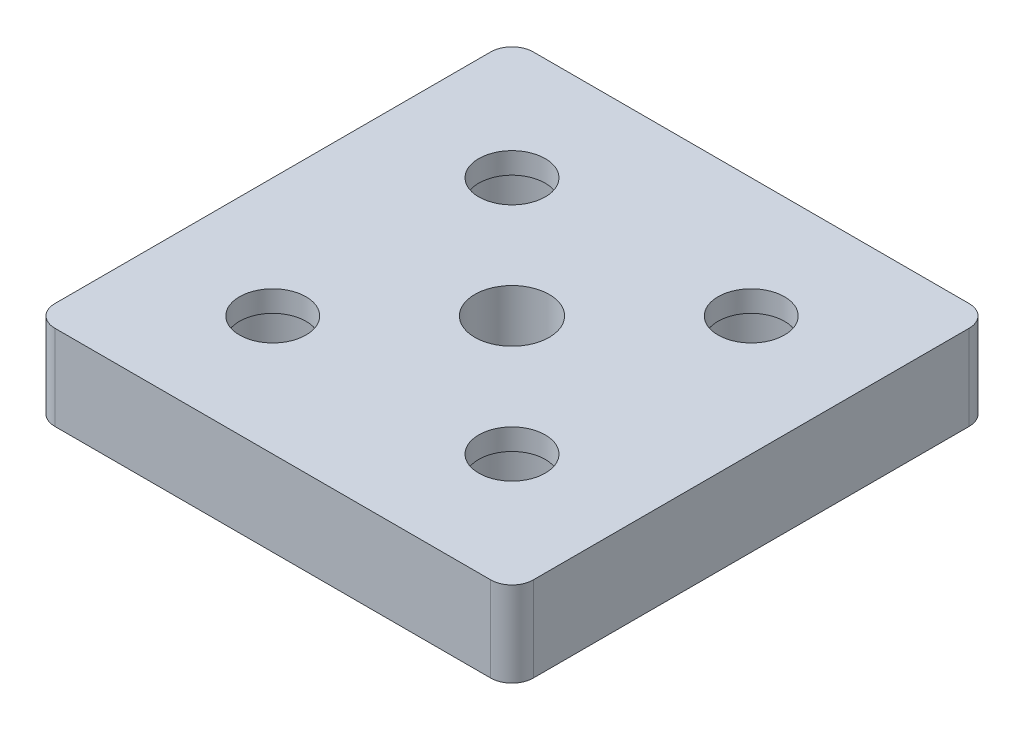
ISO-10303-21;
HEADER;
FILE_DESCRIPTION(('STEP AP214'),'2;1');
FILE_NAME('part.step','',(''),(''),'','','');
FILE_SCHEMA(('AUTOMOTIVE_DESIGN { 1 0 10303 214 1 1 1 1 }'));
ENDSEC;
DATA;
#1=APPLICATION_CONTEXT('core data for automotive mechanical design processes');
#2=APPLICATION_PROTOCOL_DEFINITION('international standard','automotive_design',2000,#1);
#3=PRODUCT_CONTEXT('',#1,'mechanical');
#4=PRODUCT('Part','Part','',(#3));
#5=PRODUCT_RELATED_PRODUCT_CATEGORY('part','',(#4));
#6=PRODUCT_DEFINITION_FORMATION('','',#4);
#7=PRODUCT_DEFINITION_CONTEXT('part definition',#1,'design');
#8=PRODUCT_DEFINITION('design','',#6,#7);
#9=PRODUCT_DEFINITION_SHAPE('','',#8);
#10=(LENGTH_UNIT() NAMED_UNIT(*) SI_UNIT(.MILLI.,.METRE.));
#11=(NAMED_UNIT(*) PLANE_ANGLE_UNIT() SI_UNIT($,.RADIAN.));
#12=(NAMED_UNIT(*) SI_UNIT($,.STERADIAN.) SOLID_ANGLE_UNIT());
#13=UNCERTAINTY_MEASURE_WITH_UNIT(LENGTH_MEASURE(1.E-05),#10,'distance_accuracy_value','');
#14=(GEOMETRIC_REPRESENTATION_CONTEXT(3) GLOBAL_UNCERTAINTY_ASSIGNED_CONTEXT((#13)) GLOBAL_UNIT_ASSIGNED_CONTEXT((#10,
#11,#12)) REPRESENTATION_CONTEXT('',''));
#15=CARTESIAN_POINT('',(0.,0.,0.));
#16=DIRECTION('',(0.,0.,1.));
#17=DIRECTION('',(1.,0.,0.));
#18=AXIS2_PLACEMENT_3D('',#15,#16,#17);
#19=CARTESIAN_POINT('',(-22.5000000000002,16.,-67.5000000000002));
#20=DIRECTION('',(0.,-1.,0.));
#21=DIRECTION('',(0.,0.,-1.));
#22=AXIS2_PLACEMENT_3D('',#19,#20,#21);
#23=CYLINDRICAL_SURFACE('',#22,6.25);
#24=CARTESIAN_POINT('',(-22.5000000000002,16.,-67.5000000000002));
#25=DIRECTION('',(0.,1.,0.));
#26=DIRECTION('',(0.,0.,1.));
#27=AXIS2_PLACEMENT_3D('',#24,#25,#26);
#28=CIRCLE('',#27,6.25);
#29=CARTESIAN_POINT('',(-22.5000000000002,16.,-61.2500000000002));
#30=VERTEX_POINT('',#29);
#31=EDGE_CURVE('E203',#30,#30,#28,.T.);
#32=ORIENTED_EDGE('',*,*,#31,.T.);
#33=EDGE_LOOP('',(#32));
#34=FACE_BOUND('',#33,.T.);
#35=CARTESIAN_POINT('',(-22.5000000000002,12.,-67.5000000000002));
#36=DIRECTION('',(0.,-1.,0.));
#37=DIRECTION('',(0.,0.,-1.));
#38=AXIS2_PLACEMENT_3D('',#35,#36,#37);
#39=CIRCLE('',#38,6.25);
#40=CARTESIAN_POINT('',(-22.5000000000002,12.,-73.7500000000002));
#41=VERTEX_POINT('',#40);
#42=EDGE_CURVE('E41',#41,#41,#39,.T.);
#43=ORIENTED_EDGE('',*,*,#42,.T.);
#44=EDGE_LOOP('',(#43));
#45=FACE_BOUND('',#44,.T.);
#46=ADVANCED_FACE('F37',(#34,#45),#23,.F.);
#47=CARTESIAN_POINT('',(-22.5,16.,-22.5000000000002));
#48=DIRECTION('',(0.,-1.,0.));
#49=DIRECTION('',(0.,0.,-1.));
#50=AXIS2_PLACEMENT_3D('',#47,#48,#49);
#51=CYLINDRICAL_SURFACE('',#50,6.25);
#52=CARTESIAN_POINT('',(-22.5,16.,-22.5000000000002));
#53=DIRECTION('',(0.,1.,0.));
#54=DIRECTION('',(0.,0.,1.));
#55=AXIS2_PLACEMENT_3D('',#52,#53,#54);
#56=CIRCLE('',#55,6.25);
#57=CARTESIAN_POINT('',(-22.5,16.,-16.2500000000002));
#58=VERTEX_POINT('',#57);
#59=EDGE_CURVE('E200',#58,#58,#56,.T.);
#60=ORIENTED_EDGE('',*,*,#59,.T.);
#61=EDGE_LOOP('',(#60));
#62=FACE_BOUND('',#61,.T.);
#63=CARTESIAN_POINT('',(-22.5,12.,-22.5000000000002));
#64=DIRECTION('',(0.,-1.,0.));
#65=DIRECTION('',(0.,0.,-1.));
#66=AXIS2_PLACEMENT_3D('',#63,#64,#65);
#67=CIRCLE('',#66,6.25);
#68=CARTESIAN_POINT('',(-22.5,12.,-28.7500000000002));
#69=VERTEX_POINT('',#68);
#70=EDGE_CURVE('E173',#69,#69,#67,.T.);
#71=ORIENTED_EDGE('',*,*,#70,.T.);
#72=EDGE_LOOP('',(#71));
#73=FACE_BOUND('',#72,.T.);
#74=ADVANCED_FACE('F244',(#62,#73),#51,.F.);
#75=CARTESIAN_POINT('',(22.5000000000002,16.,-67.5));
#76=DIRECTION('',(0.,-1.,0.));
#77=DIRECTION('',(0.,0.,-1.));
#78=AXIS2_PLACEMENT_3D('',#75,#76,#77);
#79=CYLINDRICAL_SURFACE('',#78,6.25);
#80=CARTESIAN_POINT('',(22.5000000000002,16.,-67.5));
#81=DIRECTION('',(0.,1.,0.));
#82=DIRECTION('',(0.,0.,1.));
#83=AXIS2_PLACEMENT_3D('',#80,#81,#82);
#84=CIRCLE('',#83,6.25);
#85=CARTESIAN_POINT('',(22.5000000000002,16.,-61.25));
#86=VERTEX_POINT('',#85);
#87=EDGE_CURVE('E141',#86,#86,#84,.T.);
#88=ORIENTED_EDGE('',*,*,#87,.T.);
#89=EDGE_LOOP('',(#88));
#90=FACE_BOUND('',#89,.T.);
#91=CARTESIAN_POINT('',(22.5000000000002,12.,-67.5));
#92=DIRECTION('',(0.,-1.,0.));
#93=DIRECTION('',(0.,0.,-1.));
#94=AXIS2_PLACEMENT_3D('',#91,#92,#93);
#95=CIRCLE('',#94,6.25);
#96=CARTESIAN_POINT('',(22.5000000000002,12.,-73.75));
#97=VERTEX_POINT('',#96);
#98=EDGE_CURVE('E169',#97,#97,#95,.T.);
#99=ORIENTED_EDGE('',*,*,#98,.T.);
#100=EDGE_LOOP('',(#99));
#101=FACE_BOUND('',#100,.T.);
#102=ADVANCED_FACE('F250',(#90,#101),#79,.F.);
#103=CARTESIAN_POINT('',(22.4999999999998,16.,-22.4999999999998));
#104=DIRECTION('',(0.,-1.,0.));
#105=DIRECTION('',(0.,0.,-1.));
#106=AXIS2_PLACEMENT_3D('',#103,#104,#105);
#107=CYLINDRICAL_SURFACE('',#106,6.25);
#108=CARTESIAN_POINT('',(22.4999999999998,16.,-22.4999999999998));
#109=DIRECTION('',(0.,1.,0.));
#110=DIRECTION('',(0.,0.,1.));
#111=AXIS2_PLACEMENT_3D('',#108,#109,#110);
#112=CIRCLE('',#111,6.25);
#113=CARTESIAN_POINT('',(22.4999999999998,16.,-16.2499999999998));
#114=VERTEX_POINT('',#113);
#115=EDGE_CURVE('E167',#114,#114,#112,.T.);
#116=ORIENTED_EDGE('',*,*,#115,.T.);
#117=EDGE_LOOP('',(#116));
#118=FACE_BOUND('',#117,.T.);
#119=CARTESIAN_POINT('',(22.4999999999998,12.,-22.4999999999998));
#120=DIRECTION('',(0.,-1.,0.));
#121=DIRECTION('',(0.,0.,-1.));
#122=AXIS2_PLACEMENT_3D('',#119,#120,#121);
#123=CIRCLE('',#122,6.25);
#124=CARTESIAN_POINT('',(22.4999999999998,12.,-28.7499999999998));
#125=VERTEX_POINT('',#124);
#126=EDGE_CURVE('E164',#125,#125,#123,.T.);
#127=ORIENTED_EDGE('',*,*,#126,.T.);
#128=EDGE_LOOP('',(#127));
#129=FACE_BOUND('',#128,.T.);
#130=ADVANCED_FACE('F258',(#118,#129),#107,.F.);
#131=CARTESIAN_POINT('',(-41.0000000000002,16.,-3.99999999999999));
#132=DIRECTION('',(0.,1.,0.));
#133=DIRECTION('',(0.,0.,1.));
#134=AXIS2_PLACEMENT_3D('',#131,#132,#133);
#135=PLANE('',#134);
#136=CARTESIAN_POINT('',(0.,16.,-44.9999999999999));
#137=DIRECTION('',(0.,1.,0.));
#138=DIRECTION('',(0.,0.,1.));
#139=AXIS2_PLACEMENT_3D('',#136,#137,#138);
#140=CIRCLE('',#139,7.);
#141=CARTESIAN_POINT('',(0.,16.,-38.));
#142=VERTEX_POINT('',#141);
#143=EDGE_CURVE('E472',#142,#142,#140,.T.);
#144=ORIENTED_EDGE('',*,*,#143,.F.);
#145=EDGE_LOOP('',(#144));
#146=FACE_BOUND('',#145,.T.);
#147=ORIENTED_EDGE('',*,*,#59,.F.);
#148=EDGE_LOOP('',(#147));
#149=FACE_BOUND('',#148,.T.);
#150=ORIENTED_EDGE('',*,*,#87,.F.);
#151=EDGE_LOOP('',(#150));
#152=FACE_BOUND('',#151,.T.);
#153=CARTESIAN_POINT('',(-41.0000000000002,16.,-3.99999999999999));
#154=DIRECTION('',(0.,1.,0.));
#155=DIRECTION('',(0.,0.,1.));
#156=AXIS2_PLACEMENT_3D('',#153,#154,#155);
#157=CIRCLE('',#156,3.99999999999999);
#158=CARTESIAN_POINT('',(-45.0000000000002,16.,-4.));
#159=VERTEX_POINT('',#158);
#160=CARTESIAN_POINT('',(-41.0000000000002,16.,0.));
#161=VERTEX_POINT('',#160);
#162=EDGE_CURVE('E152',#159,#161,#157,.T.);
#163=ORIENTED_EDGE('',*,*,#162,.T.);
#164=DIRECTION('',(1.,0.,0.));
#165=VECTOR('',#164,1.);
#166=CARTESIAN_POINT('',(-41.0000000000002,16.,0.));
#167=LINE('',#166,#165);
#168=CARTESIAN_POINT('',(41.0000000000002,16.,0.));
#169=VERTEX_POINT('',#168);
#170=EDGE_CURVE('E99',#161,#169,#167,.T.);
#171=ORIENTED_EDGE('',*,*,#170,.T.);
#172=CARTESIAN_POINT('',(41.0000000000002,16.,-4.));
#173=DIRECTION('',(0.,1.,0.));
#174=DIRECTION('',(0.,0.,1.));
#175=AXIS2_PLACEMENT_3D('',#172,#173,#174);
#176=CIRCLE('',#175,4.);
#177=CARTESIAN_POINT('',(45.0000000000002,16.,-4.));
#178=VERTEX_POINT('',#177);
#179=EDGE_CURVE('E210',#169,#178,#176,.T.);
#180=ORIENTED_EDGE('',*,*,#179,.T.);
#181=DIRECTION('',(0.,0.,-1.));
#182=VECTOR('',#181,1.);
#183=CARTESIAN_POINT('',(45.0000000000002,16.,-4.));
#184=LINE('',#183,#182);
#185=CARTESIAN_POINT('',(45.0000000000002,16.,-85.9999999999999));
#186=VERTEX_POINT('',#185);
#187=EDGE_CURVE('E212',#178,#186,#184,.T.);
#188=ORIENTED_EDGE('',*,*,#187,.T.);
#189=CARTESIAN_POINT('',(41.0000000000002,16.,-85.9999999999999));
#190=DIRECTION('',(0.,1.,0.));
#191=DIRECTION('',(0.,0.,1.));
#192=AXIS2_PLACEMENT_3D('',#189,#190,#191);
#193=CIRCLE('',#192,4.);
#194=CARTESIAN_POINT('',(41.0000000000002,16.,-89.9999999999999));
#195=VERTEX_POINT('',#194);
#196=EDGE_CURVE('E119',#186,#195,#193,.T.);
#197=ORIENTED_EDGE('',*,*,#196,.T.);
#198=DIRECTION('',(-1.,0.,0.));
#199=VECTOR('',#198,1.);
#200=CARTESIAN_POINT('',(41.0000000000002,16.,-89.9999999999999));
#201=LINE('',#200,#199);
#202=CARTESIAN_POINT('',(-40.9999999999995,16.,-89.9999999999999));
#203=VERTEX_POINT('',#202);
#204=EDGE_CURVE('E112',#195,#203,#201,.T.);
#205=ORIENTED_EDGE('',*,*,#204,.T.);
#206=CARTESIAN_POINT('',(-40.9999999999995,16.,-85.9999999999999));
#207=DIRECTION('',(0.,1.,0.));
#208=DIRECTION('',(0.,0.,1.));
#209=AXIS2_PLACEMENT_3D('',#206,#207,#208);
#210=CIRCLE('',#209,4.);
#211=CARTESIAN_POINT('',(-44.9999999999995,16.,-85.9999999999999));
#212=VERTEX_POINT('',#211);
#213=EDGE_CURVE('E117',#203,#212,#210,.T.);
#214=ORIENTED_EDGE('',*,*,#213,.T.);
#215=DIRECTION('',(0.,0.,1.));
#216=VECTOR('',#215,1.);
#217=CARTESIAN_POINT('',(-44.9999999999995,16.,-85.9999999999999));
#218=LINE('',#217,#216);
#219=EDGE_CURVE('E56',#212,#159,#218,.T.);
#220=ORIENTED_EDGE('',*,*,#219,.T.);
#221=EDGE_LOOP('',(#163,#171,#180,#188,#197,#205,#214,#220));
#222=FACE_BOUND('',#221,.T.);
#223=ORIENTED_EDGE('',*,*,#31,.F.);
#224=EDGE_LOOP('',(#223));
#225=FACE_BOUND('',#224,.T.);
#226=ORIENTED_EDGE('',*,*,#115,.F.);
#227=EDGE_LOOP('',(#226));
#228=FACE_BOUND('',#227,.T.);
#229=ADVANCED_FACE('F114',(#146,#149,#152,#222,#225,#228),#135,.T.);
#230=CARTESIAN_POINT('',(-41.0000000000002,0.,-3.99999999999999));
#231=DIRECTION('',(0.,1.,0.));
#232=DIRECTION('',(0.,0.,1.));
#233=AXIS2_PLACEMENT_3D('',#230,#231,#232);
#234=PLANE('',#233);
#235=CARTESIAN_POINT('',(0.,0.,-44.9999999999999));
#236=DIRECTION('',(0.,1.,0.));
#237=DIRECTION('',(0.,0.,1.));
#238=AXIS2_PLACEMENT_3D('',#235,#236,#237);
#239=CIRCLE('',#238,6.99999999999999);
#240=CARTESIAN_POINT('',(0.,0.,-38.));
#241=VERTEX_POINT('',#240);
#242=EDGE_CURVE('E271',#241,#241,#239,.T.);
#243=ORIENTED_EDGE('',*,*,#242,.T.);
#244=EDGE_LOOP('',(#243));
#245=FACE_BOUND('',#244,.T.);
#246=CARTESIAN_POINT('',(-22.4999999999995,0.,-67.5000000000005));
#247=DIRECTION('',(0.,-1.,0.));
#248=DIRECTION('',(0.,0.,-1.));
#249=AXIS2_PLACEMENT_3D('',#246,#247,#248);
#250=CIRCLE('',#249,9.25);
#251=CARTESIAN_POINT('',(-22.4999999999995,0.,-76.7500000000004));
#252=VERTEX_POINT('',#251);
#253=EDGE_CURVE('E189',#252,#252,#250,.T.);
#254=ORIENTED_EDGE('',*,*,#253,.F.);
#255=EDGE_LOOP('',(#254));
#256=FACE_BOUND('',#255,.T.);
#257=CARTESIAN_POINT('',(-22.5,0.,-22.5000000000002));
#258=DIRECTION('',(0.,-1.,0.));
#259=DIRECTION('',(0.,0.,-1.));
#260=AXIS2_PLACEMENT_3D('',#257,#258,#259);
#261=CIRCLE('',#260,9.24999999999999);
#262=CARTESIAN_POINT('',(-22.5,0.,-31.7500000000002));
#263=VERTEX_POINT('',#262);
#264=EDGE_CURVE('E182',#263,#263,#261,.T.);
#265=ORIENTED_EDGE('',*,*,#264,.F.);
#266=EDGE_LOOP('',(#265));
#267=FACE_BOUND('',#266,.T.);
#268=CARTESIAN_POINT('',(22.5000000000002,0.,-67.5));
#269=DIRECTION('',(0.,-1.,0.));
#270=DIRECTION('',(0.,0.,-1.));
#271=AXIS2_PLACEMENT_3D('',#268,#269,#270);
#272=CIRCLE('',#271,9.24999999999999);
#273=CARTESIAN_POINT('',(22.5000000000002,0.,-76.75));
#274=VERTEX_POINT('',#273);
#275=EDGE_CURVE('E175',#274,#274,#272,.T.);
#276=ORIENTED_EDGE('',*,*,#275,.F.);
#277=EDGE_LOOP('',(#276));
#278=FACE_BOUND('',#277,.T.);
#279=CARTESIAN_POINT('',(22.4999999999998,0.,-22.4999999999998));
#280=DIRECTION('',(0.,-1.,0.));
#281=DIRECTION('',(0.,0.,-1.));
#282=AXIS2_PLACEMENT_3D('',#279,#280,#281);
#283=CIRCLE('',#282,9.24999999999999);
#284=CARTESIAN_POINT('',(22.4999999999998,0.,-31.7499999999998));
#285=VERTEX_POINT('',#284);
#286=EDGE_CURVE('E171',#285,#285,#283,.T.);
#287=ORIENTED_EDGE('',*,*,#286,.F.);
#288=EDGE_LOOP('',(#287));
#289=FACE_BOUND('',#288,.T.);
#290=CARTESIAN_POINT('',(-41.0000000000002,0.,-3.99999999999999));
#291=DIRECTION('',(0.,1.,0.));
#292=DIRECTION('',(0.,0.,1.));
#293=AXIS2_PLACEMENT_3D('',#290,#291,#292);
#294=CIRCLE('',#293,3.99999999999999);
#295=CARTESIAN_POINT('',(-45.0000000000002,0.,-4.));
#296=VERTEX_POINT('',#295);
#297=CARTESIAN_POINT('',(-41.0000000000002,0.,0.));
#298=VERTEX_POINT('',#297);
#299=EDGE_CURVE('E137',#296,#298,#294,.T.);
#300=ORIENTED_EDGE('',*,*,#299,.F.);
#301=DIRECTION('',(0.,0.,1.));
#302=VECTOR('',#301,1.);
#303=CARTESIAN_POINT('',(-44.9999999999995,0.,-85.9999999999999));
#304=LINE('',#303,#302);
#305=CARTESIAN_POINT('',(-44.9999999999995,0.,-85.9999999999999));
#306=VERTEX_POINT('',#305);
#307=EDGE_CURVE('E91',#306,#296,#304,.T.);
#308=ORIENTED_EDGE('',*,*,#307,.F.);
#309=CARTESIAN_POINT('',(-40.9999999999995,0.,-85.9999999999999));
#310=DIRECTION('',(0.,1.,0.));
#311=DIRECTION('',(0.,0.,1.));
#312=AXIS2_PLACEMENT_3D('',#309,#310,#311);
#313=CIRCLE('',#312,4.);
#314=CARTESIAN_POINT('',(-40.9999999999995,0.,-89.9999999999999));
#315=VERTEX_POINT('',#314);
#316=EDGE_CURVE('E85',#315,#306,#313,.T.);
#317=ORIENTED_EDGE('',*,*,#316,.F.);
#318=DIRECTION('',(-1.,0.,0.));
#319=VECTOR('',#318,1.);
#320=CARTESIAN_POINT('',(41.0000000000002,0.,-89.9999999999999));
#321=LINE('',#320,#319);
#322=CARTESIAN_POINT('',(41.0000000000002,0.,-89.9999999999999));
#323=VERTEX_POINT('',#322);
#324=EDGE_CURVE('E127',#323,#315,#321,.T.);
#325=ORIENTED_EDGE('',*,*,#324,.F.);
#326=CARTESIAN_POINT('',(41.0000000000002,0.,-85.9999999999999));
#327=DIRECTION('',(0.,1.,0.));
#328=DIRECTION('',(0.,0.,1.));
#329=AXIS2_PLACEMENT_3D('',#326,#327,#328);
#330=CIRCLE('',#329,4.);
#331=CARTESIAN_POINT('',(45.0000000000002,0.,-85.9999999999999));
#332=VERTEX_POINT('',#331);
#333=EDGE_CURVE('E147',#332,#323,#330,.T.);
#334=ORIENTED_EDGE('',*,*,#333,.F.);
#335=DIRECTION('',(0.,0.,-1.));
#336=VECTOR('',#335,1.);
#337=CARTESIAN_POINT('',(45.0000000000002,0.,-4.));
#338=LINE('',#337,#336);
#339=CARTESIAN_POINT('',(45.0000000000002,0.,-4.));
#340=VERTEX_POINT('',#339);
#341=EDGE_CURVE('E145',#340,#332,#338,.T.);
#342=ORIENTED_EDGE('',*,*,#341,.F.);
#343=CARTESIAN_POINT('',(41.0000000000002,0.,-4.));
#344=DIRECTION('',(0.,1.,0.));
#345=DIRECTION('',(0.,0.,1.));
#346=AXIS2_PLACEMENT_3D('',#343,#344,#345);
#347=CIRCLE('',#346,4.);
#348=CARTESIAN_POINT('',(41.0000000000002,0.,0.));
#349=VERTEX_POINT('',#348);
#350=EDGE_CURVE('E143',#349,#340,#347,.T.);
#351=ORIENTED_EDGE('',*,*,#350,.F.);
#352=DIRECTION('',(1.,0.,0.));
#353=VECTOR('',#352,1.);
#354=CARTESIAN_POINT('',(-41.0000000000002,0.,0.));
#355=LINE('',#354,#353);
#356=EDGE_CURVE('E140',#298,#349,#355,.T.);
#357=ORIENTED_EDGE('',*,*,#356,.F.);
#358=EDGE_LOOP('',(#300,#308,#317,#325,#334,#342,#351,#357));
#359=FACE_BOUND('',#358,.T.);
#360=ADVANCED_FACE('F225',(#245,#256,#267,#278,#289,#359),#234,.F.);
#361=CARTESIAN_POINT('',(-41.0000000000002,16.,-3.99999999999999));
#362=DIRECTION('',(0.,-1.,0.));
#363=DIRECTION('',(0.,0.,-1.));
#364=AXIS2_PLACEMENT_3D('',#361,#362,#363);
#365=CYLINDRICAL_SURFACE('',#364,3.99999999999999);
#366=ORIENTED_EDGE('',*,*,#299,.T.);
#367=DIRECTION('',(0.,-1.,0.));
#368=VECTOR('',#367,1.);
#369=CARTESIAN_POINT('',(-41.0000000000002,16.,0.));
#370=LINE('',#369,#368);
#371=EDGE_CURVE('E11',#161,#298,#370,.T.);
#372=ORIENTED_EDGE('',*,*,#371,.F.);
#373=ORIENTED_EDGE('',*,*,#162,.F.);
#374=DIRECTION('',(0.,-1.,0.));
#375=VECTOR('',#374,1.);
#376=CARTESIAN_POINT('',(-45.0000000000002,16.,-4.));
#377=LINE('',#376,#375);
#378=EDGE_CURVE('E133',#159,#296,#377,.T.);
#379=ORIENTED_EDGE('',*,*,#378,.T.);
#380=EDGE_LOOP('',(#366,#372,#373,#379));
#381=FACE_BOUND('',#380,.T.);
#382=ADVANCED_FACE('F39',(#381),#365,.T.);
#383=CARTESIAN_POINT('',(-41.0000000000002,16.,0.));
#384=DIRECTION('',(0.,0.,-1.));
#385=DIRECTION('',(-1.,0.,0.));
#386=AXIS2_PLACEMENT_3D('',#383,#384,#385);
#387=PLANE('',#386);
#388=ORIENTED_EDGE('',*,*,#356,.T.);
#389=DIRECTION('',(0.,-1.,0.));
#390=VECTOR('',#389,1.);
#391=CARTESIAN_POINT('',(41.0000000000002,16.,0.));
#392=LINE('',#391,#390);
#393=EDGE_CURVE('E47',#169,#349,#392,.T.);
#394=ORIENTED_EDGE('',*,*,#393,.F.);
#395=ORIENTED_EDGE('',*,*,#170,.F.);
#396=ORIENTED_EDGE('',*,*,#371,.T.);
#397=EDGE_LOOP('',(#388,#394,#395,#396));
#398=FACE_BOUND('',#397,.T.);
#399=ADVANCED_FACE('F267',(#398),#387,.F.);
#400=CARTESIAN_POINT('',(41.0000000000002,16.,-4.));
#401=DIRECTION('',(0.,-1.,0.));
#402=DIRECTION('',(0.,0.,-1.));
#403=AXIS2_PLACEMENT_3D('',#400,#401,#402);
#404=CYLINDRICAL_SURFACE('',#403,4.);
#405=ORIENTED_EDGE('',*,*,#350,.T.);
#406=DIRECTION('',(0.,-1.,0.));
#407=VECTOR('',#406,1.);
#408=CARTESIAN_POINT('',(45.0000000000002,16.,-4.));
#409=LINE('',#408,#407);
#410=EDGE_CURVE('E159',#178,#340,#409,.T.);
#411=ORIENTED_EDGE('',*,*,#410,.F.);
#412=ORIENTED_EDGE('',*,*,#179,.F.);
#413=ORIENTED_EDGE('',*,*,#393,.T.);
#414=EDGE_LOOP('',(#405,#411,#412,#413));
#415=FACE_BOUND('',#414,.T.);
#416=ADVANCED_FACE('F431',(#415),#404,.T.);
#417=CARTESIAN_POINT('',(45.0000000000002,16.,-4.));
#418=DIRECTION('',(-1.,0.,0.));
#419=DIRECTION('',(0.,0.,1.));
#420=AXIS2_PLACEMENT_3D('',#417,#418,#419);
#421=PLANE('',#420);
#422=ORIENTED_EDGE('',*,*,#341,.T.);
#423=DIRECTION('',(0.,-1.,0.));
#424=VECTOR('',#423,1.);
#425=CARTESIAN_POINT('',(45.0000000000002,16.,-85.9999999999999));
#426=LINE('',#425,#424);
#427=EDGE_CURVE('E156',#186,#332,#426,.T.);
#428=ORIENTED_EDGE('',*,*,#427,.F.);
#429=ORIENTED_EDGE('',*,*,#187,.F.);
#430=ORIENTED_EDGE('',*,*,#410,.T.);
#431=EDGE_LOOP('',(#422,#428,#429,#430));
#432=FACE_BOUND('',#431,.T.);
#433=ADVANCED_FACE('F218',(#432),#421,.F.);
#434=CARTESIAN_POINT('',(41.0000000000002,16.,-85.9999999999999));
#435=DIRECTION('',(0.,-1.,0.));
#436=DIRECTION('',(0.,0.,-1.));
#437=AXIS2_PLACEMENT_3D('',#434,#435,#436);
#438=CYLINDRICAL_SURFACE('',#437,4.);
#439=ORIENTED_EDGE('',*,*,#333,.T.);
#440=DIRECTION('',(0.,-1.,0.));
#441=VECTOR('',#440,1.);
#442=CARTESIAN_POINT('',(41.0000000000002,16.,-89.9999999999999));
#443=LINE('',#442,#441);
#444=EDGE_CURVE('E128',#195,#323,#443,.T.);
#445=ORIENTED_EDGE('',*,*,#444,.F.);
#446=ORIENTED_EDGE('',*,*,#196,.F.);
#447=ORIENTED_EDGE('',*,*,#427,.T.);
#448=EDGE_LOOP('',(#439,#445,#446,#447));
#449=FACE_BOUND('',#448,.T.);
#450=ADVANCED_FACE('F222',(#449),#438,.T.);
#451=CARTESIAN_POINT('',(41.0000000000002,16.,-89.9999999999999));
#452=DIRECTION('',(0.,0.,1.));
#453=DIRECTION('',(1.,0.,0.));
#454=AXIS2_PLACEMENT_3D('',#451,#452,#453);
#455=PLANE('',#454);
#456=ORIENTED_EDGE('',*,*,#324,.T.);
#457=DIRECTION('',(0.,-1.,0.));
#458=VECTOR('',#457,1.);
#459=CARTESIAN_POINT('',(-40.9999999999995,16.,-89.9999999999999));
#460=LINE('',#459,#458);
#461=EDGE_CURVE('E124',#203,#315,#460,.T.);
#462=ORIENTED_EDGE('',*,*,#461,.F.);
#463=ORIENTED_EDGE('',*,*,#204,.F.);
#464=ORIENTED_EDGE('',*,*,#444,.T.);
#465=EDGE_LOOP('',(#456,#462,#463,#464));
#466=FACE_BOUND('',#465,.T.);
#467=ADVANCED_FACE('F125',(#466),#455,.F.);
#468=CARTESIAN_POINT('',(-40.9999999999995,16.,-85.9999999999999));
#469=DIRECTION('',(0.,-1.,0.));
#470=DIRECTION('',(0.,0.,-1.));
#471=AXIS2_PLACEMENT_3D('',#468,#469,#470);
#472=CYLINDRICAL_SURFACE('',#471,4.);
#473=ORIENTED_EDGE('',*,*,#316,.T.);
#474=DIRECTION('',(0.,-1.,0.));
#475=VECTOR('',#474,1.);
#476=CARTESIAN_POINT('',(-44.9999999999995,16.,-85.9999999999999));
#477=LINE('',#476,#475);
#478=EDGE_CURVE('E129',#212,#306,#477,.T.);
#479=ORIENTED_EDGE('',*,*,#478,.F.);
#480=ORIENTED_EDGE('',*,*,#213,.F.);
#481=ORIENTED_EDGE('',*,*,#461,.T.);
#482=EDGE_LOOP('',(#473,#479,#480,#481));
#483=FACE_BOUND('',#482,.T.);
#484=ADVANCED_FACE('F131',(#483),#472,.T.);
#485=CARTESIAN_POINT('',(-44.9999999999995,16.,-85.9999999999999));
#486=DIRECTION('',(1.,0.,0.));
#487=DIRECTION('',(0.,0.,-1.));
#488=AXIS2_PLACEMENT_3D('',#485,#486,#487);
#489=PLANE('',#488);
#490=ORIENTED_EDGE('',*,*,#307,.T.);
#491=ORIENTED_EDGE('',*,*,#378,.F.);
#492=ORIENTED_EDGE('',*,*,#219,.F.);
#493=ORIENTED_EDGE('',*,*,#478,.T.);
#494=EDGE_LOOP('',(#490,#491,#492,#493));
#495=FACE_BOUND('',#494,.T.);
#496=ADVANCED_FACE('F230',(#495),#489,.F.);
#497=CARTESIAN_POINT('',(22.4999999999998,12.,-22.4999999999998));
#498=DIRECTION('',(0.,-1.,0.));
#499=DIRECTION('',(0.,0.,-1.));
#500=AXIS2_PLACEMENT_3D('',#497,#498,#499);
#501=CYLINDRICAL_SURFACE('',#500,9.24999999999999);
#502=CARTESIAN_POINT('',(22.4999999999998,12.,-22.4999999999998));
#503=DIRECTION('',(0.,-1.,0.));
#504=DIRECTION('',(0.,0.,-1.));
#505=AXIS2_PLACEMENT_3D('',#502,#503,#504);
#506=CIRCLE('',#505,9.24999999999999);
#507=CARTESIAN_POINT('',(22.4999999999998,12.,-31.7499999999998));
#508=VERTEX_POINT('',#507);
#509=EDGE_CURVE('E168',#508,#508,#506,.T.);
#510=ORIENTED_EDGE('',*,*,#509,.F.);
#511=EDGE_LOOP('',(#510));
#512=FACE_BOUND('',#511,.T.);
#513=ORIENTED_EDGE('',*,*,#286,.T.);
#514=EDGE_LOOP('',(#513));
#515=FACE_BOUND('',#514,.T.);
#516=ADVANCED_FACE('F232',(#512,#515),#501,.F.);
#517=CARTESIAN_POINT('',(22.4999999999998,12.,-22.4999999999998));
#518=DIRECTION('',(0.,-1.,0.));
#519=DIRECTION('',(0.,0.,-1.));
#520=AXIS2_PLACEMENT_3D('',#517,#518,#519);
#521=PLANE('',#520);
#522=ORIENTED_EDGE('',*,*,#126,.F.);
#523=EDGE_LOOP('',(#522));
#524=FACE_BOUND('',#523,.T.);
#525=ORIENTED_EDGE('',*,*,#509,.T.);
#526=EDGE_LOOP('',(#525));
#527=FACE_BOUND('',#526,.T.);
#528=ADVANCED_FACE('F238',(#524,#527),#521,.T.);
#529=CARTESIAN_POINT('',(22.5000000000002,12.,-67.5));
#530=DIRECTION('',(0.,-1.,0.));
#531=DIRECTION('',(0.,0.,-1.));
#532=AXIS2_PLACEMENT_3D('',#529,#530,#531);
#533=CYLINDRICAL_SURFACE('',#532,9.24999999999999);
#534=CARTESIAN_POINT('',(22.5000000000002,12.,-67.5));
#535=DIRECTION('',(0.,-1.,0.));
#536=DIRECTION('',(0.,0.,-1.));
#537=AXIS2_PLACEMENT_3D('',#534,#535,#536);
#538=CIRCLE('',#537,9.24999999999999);
#539=CARTESIAN_POINT('',(22.5000000000002,12.,-76.75));
#540=VERTEX_POINT('',#539);
#541=EDGE_CURVE('E172',#540,#540,#538,.T.);
#542=ORIENTED_EDGE('',*,*,#541,.F.);
#543=EDGE_LOOP('',(#542));
#544=FACE_BOUND('',#543,.T.);
#545=ORIENTED_EDGE('',*,*,#275,.T.);
#546=EDGE_LOOP('',(#545));
#547=FACE_BOUND('',#546,.T.);
#548=ADVANCED_FACE('F282',(#544,#547),#533,.F.);
#549=CARTESIAN_POINT('',(22.5000000000002,12.,-67.5));
#550=DIRECTION('',(0.,-1.,0.));
#551=DIRECTION('',(0.,0.,-1.));
#552=AXIS2_PLACEMENT_3D('',#549,#550,#551);
#553=PLANE('',#552);
#554=ORIENTED_EDGE('',*,*,#98,.F.);
#555=EDGE_LOOP('',(#554));
#556=FACE_BOUND('',#555,.T.);
#557=ORIENTED_EDGE('',*,*,#541,.T.);
#558=EDGE_LOOP('',(#557));
#559=FACE_BOUND('',#558,.T.);
#560=ADVANCED_FACE('F284',(#556,#559),#553,.T.);
#561=CARTESIAN_POINT('',(-22.5,12.,-22.5000000000002));
#562=DIRECTION('',(0.,-1.,0.));
#563=DIRECTION('',(0.,0.,-1.));
#564=AXIS2_PLACEMENT_3D('',#561,#562,#563);
#565=CYLINDRICAL_SURFACE('',#564,9.24999999999999);
#566=CARTESIAN_POINT('',(-22.5,12.,-22.5000000000002));
#567=DIRECTION('',(0.,-1.,0.));
#568=DIRECTION('',(0.,0.,-1.));
#569=AXIS2_PLACEMENT_3D('',#566,#567,#568);
#570=CIRCLE('',#569,9.24999999999999);
#571=CARTESIAN_POINT('',(-22.5,12.,-31.7500000000002));
#572=VERTEX_POINT('',#571);
#573=EDGE_CURVE('E176',#572,#572,#570,.T.);
#574=ORIENTED_EDGE('',*,*,#573,.F.);
#575=EDGE_LOOP('',(#574));
#576=FACE_BOUND('',#575,.T.);
#577=ORIENTED_EDGE('',*,*,#264,.T.);
#578=EDGE_LOOP('',(#577));
#579=FACE_BOUND('',#578,.T.);
#580=ADVANCED_FACE('F291',(#576,#579),#565,.F.);
#581=CARTESIAN_POINT('',(-22.5,12.,-22.5000000000002));
#582=DIRECTION('',(0.,-1.,0.));
#583=DIRECTION('',(0.,0.,-1.));
#584=AXIS2_PLACEMENT_3D('',#581,#582,#583);
#585=PLANE('',#584);
#586=ORIENTED_EDGE('',*,*,#70,.F.);
#587=EDGE_LOOP('',(#586));
#588=FACE_BOUND('',#587,.T.);
#589=ORIENTED_EDGE('',*,*,#573,.T.);
#590=EDGE_LOOP('',(#589));
#591=FACE_BOUND('',#590,.T.);
#592=ADVANCED_FACE('F349',(#588,#591),#585,.T.);
#593=CARTESIAN_POINT('',(-22.4999999999995,12.,-67.5000000000005));
#594=DIRECTION('',(0.,-1.,0.));
#595=DIRECTION('',(0.,0.,-1.));
#596=AXIS2_PLACEMENT_3D('',#593,#594,#595);
#597=CYLINDRICAL_SURFACE('',#596,9.25);
#598=CARTESIAN_POINT('',(-22.4999999999995,12.,-67.5000000000005));
#599=DIRECTION('',(0.,-1.,0.));
#600=DIRECTION('',(0.,0.,-1.));
#601=AXIS2_PLACEMENT_3D('',#598,#599,#600);
#602=CIRCLE('',#601,9.25);
#603=CARTESIAN_POINT('',(-22.4999999999995,12.,-76.7500000000004));
#604=VERTEX_POINT('',#603);
#605=EDGE_CURVE('E471',#604,#604,#602,.T.);
#606=ORIENTED_EDGE('',*,*,#605,.F.);
#607=EDGE_LOOP('',(#606));
#608=FACE_BOUND('',#607,.T.);
#609=ORIENTED_EDGE('',*,*,#253,.T.);
#610=EDGE_LOOP('',(#609));
#611=FACE_BOUND('',#610,.T.);
#612=ADVANCED_FACE('F344',(#608,#611),#597,.F.);
#613=CARTESIAN_POINT('',(-22.4999999999995,12.,-67.5000000000005));
#614=DIRECTION('',(0.,-1.,0.));
#615=DIRECTION('',(0.,0.,-1.));
#616=AXIS2_PLACEMENT_3D('',#613,#614,#615);
#617=PLANE('',#616);
#618=ORIENTED_EDGE('',*,*,#42,.F.);
#619=EDGE_LOOP('',(#618));
#620=FACE_BOUND('',#619,.T.);
#621=ORIENTED_EDGE('',*,*,#605,.T.);
#622=EDGE_LOOP('',(#621));
#623=FACE_BOUND('',#622,.T.);
#624=ADVANCED_FACE('F321',(#620,#623),#617,.T.);
#625=CARTESIAN_POINT('',(0.,16.,-44.9999999999999));
#626=DIRECTION('',(0.,1.,0.));
#627=DIRECTION('',(0.,0.,1.));
#628=AXIS2_PLACEMENT_3D('',#625,#626,#627);
#629=CYLINDRICAL_SURFACE('',#628,6.99999999999999);
#630=ORIENTED_EDGE('',*,*,#143,.T.);
#631=EDGE_LOOP('',(#630));
#632=FACE_BOUND('',#631,.T.);
#633=ORIENTED_EDGE('',*,*,#242,.F.);
#634=EDGE_LOOP('',(#633));
#635=FACE_BOUND('',#634,.T.);
#636=ADVANCED_FACE('F331',(#632,#635),#629,.F.);
#637=CLOSED_SHELL('',(#46,#74,#102,#130,#229,#360,#382,#399,#416,#433,#450,#467,#484,#496,#516,
#528,#548,#560,#580,#592,#612,#624,#636));
#638=MANIFOLD_SOLID_BREP('B2',#637);
#639=ADVANCED_BREP_SHAPE_REPRESENTATION('',(#18,#638),#14);
#640=SHAPE_DEFINITION_REPRESENTATION(#9,#639);
ENDSEC;
END-ISO-10303-21;
